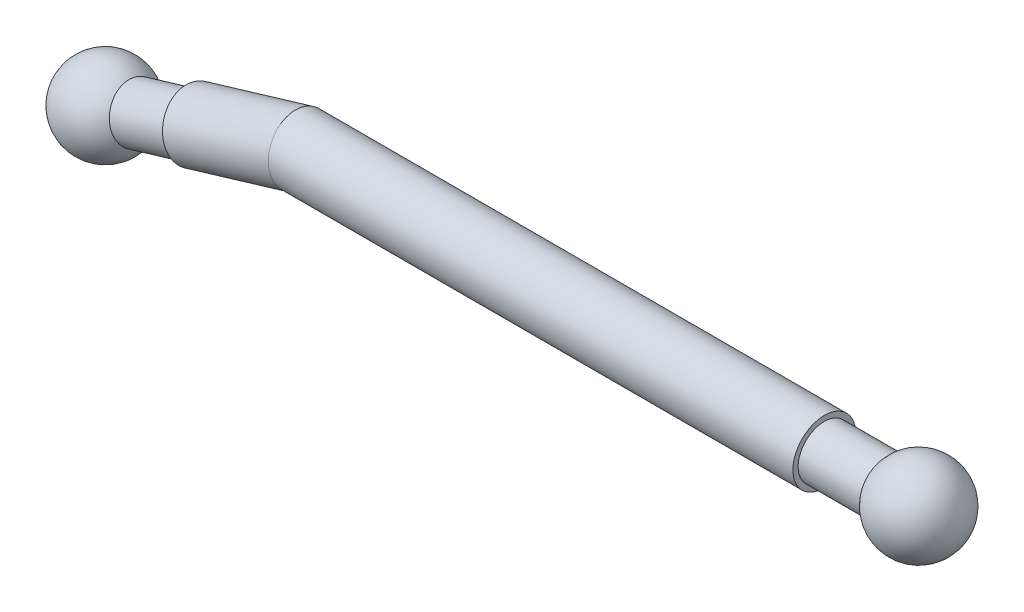
ISO-10303-21;
HEADER;
FILE_DESCRIPTION(('STEP AP214'),'2;1');
FILE_NAME('part.step','',(''),(''),'','','');
FILE_SCHEMA(('AUTOMOTIVE_DESIGN { 1 0 10303 214 1 1 1 1 }'));
ENDSEC;
DATA;
#1=APPLICATION_CONTEXT('core data for automotive mechanical design processes');
#2=APPLICATION_PROTOCOL_DEFINITION('international standard','automotive_design',2000,#1);
#3=PRODUCT_CONTEXT('',#1,'mechanical');
#4=PRODUCT('Part','Part','',(#3));
#5=PRODUCT_RELATED_PRODUCT_CATEGORY('part','',(#4));
#6=PRODUCT_DEFINITION_FORMATION('','',#4);
#7=PRODUCT_DEFINITION_CONTEXT('part definition',#1,'design');
#8=PRODUCT_DEFINITION('design','',#6,#7);
#9=PRODUCT_DEFINITION_SHAPE('','',#8);
#10=(LENGTH_UNIT() NAMED_UNIT(*) SI_UNIT(.MILLI.,.METRE.));
#11=(NAMED_UNIT(*) PLANE_ANGLE_UNIT() SI_UNIT($,.RADIAN.));
#12=(NAMED_UNIT(*) SI_UNIT($,.STERADIAN.) SOLID_ANGLE_UNIT());
#13=UNCERTAINTY_MEASURE_WITH_UNIT(LENGTH_MEASURE(1.E-05),#10,'distance_accuracy_value','');
#14=(GEOMETRIC_REPRESENTATION_CONTEXT(3) GLOBAL_UNCERTAINTY_ASSIGNED_CONTEXT((#13)) GLOBAL_UNIT_ASSIGNED_CONTEXT((#10,
#11,#12)) REPRESENTATION_CONTEXT('',''));
#15=CARTESIAN_POINT('',(0.,0.,0.));
#16=DIRECTION('',(0.,0.,1.));
#17=DIRECTION('',(1.,0.,0.));
#18=AXIS2_PLACEMENT_3D('',#15,#16,#17);
#19=CARTESIAN_POINT('',(6.,0.,0.));
#20=DIRECTION('',(-1.,0.,0.));
#21=DIRECTION('',(0.,0.,1.));
#22=AXIS2_PLACEMENT_3D('',#19,#20,#21);
#23=CYLINDRICAL_SURFACE('',#22,2.5);
#24=CARTESIAN_POINT('',(0.,0.,0.));
#25=DIRECTION('',(1.,0.,0.));
#26=DIRECTION('',(0.,0.,-1.));
#27=AXIS2_PLACEMENT_3D('',#24,#25,#26);
#28=CIRCLE('',#27,2.5);
#29=CARTESIAN_POINT('',(0.,0.,-2.5));
#30=VERTEX_POINT('',#29);
#31=EDGE_CURVE('E52',#30,#30,#28,.T.);
#32=ORIENTED_EDGE('',*,*,#31,.T.);
#33=EDGE_LOOP('',(#32));
#34=FACE_BOUND('',#33,.T.);
#35=CARTESIAN_POINT('',(5.8775010008008,0.,0.));
#36=DIRECTION('',(1.,0.,0.));
#37=DIRECTION('',(0.,0.,-1.));
#38=AXIS2_PLACEMENT_3D('',#35,#36,#37);
#39=CIRCLE('',#38,2.5);
#40=CARTESIAN_POINT('',(5.8775010008008,0.,-2.5));
#41=VERTEX_POINT('',#40);
#42=EDGE_CURVE('E13',#41,#41,#39,.T.);
#43=ORIENTED_EDGE('',*,*,#42,.F.);
#44=EDGE_LOOP('',(#43));
#45=FACE_BOUND('',#44,.T.);
#46=ADVANCED_FACE('F44',(#34,#45),#23,.T.);
#47=CARTESIAN_POINT('',(-65.7083900276338,-4.85264625904171,0.));
#48=DIRECTION('',(0.957826285221151,0.287347885566345,0.));
#49=DIRECTION('',(-0.287347885566345,0.957826285221152,0.));
#50=AXIS2_PLACEMENT_3D('',#47,#48,#49);
#51=CYLINDRICAL_SURFACE('',#50,2.5);
#52=CARTESIAN_POINT('',(-59.9614323163069,-3.12855894564364,0.));
#53=DIRECTION('',(-0.957826285221152,-0.287347885566345,0.));
#54=DIRECTION('',(0.287347885566345,-0.957826285221152,0.));
#55=AXIS2_PLACEMENT_3D('',#52,#53,#54);
#56=CIRCLE('',#55,2.5);
#57=CARTESIAN_POINT('',(-59.2430626023911,-5.52312465869652,0.));
#58=VERTEX_POINT('',#57);
#59=EDGE_CURVE('E70',#58,#58,#56,.T.);
#60=ORIENTED_EDGE('',*,*,#59,.T.);
#61=EDGE_LOOP('',(#60));
#62=FACE_BOUND('',#61,.T.);
#63=CARTESIAN_POINT('',(-65.5910572662876,-4.81744643063784,0.));
#64=DIRECTION('',(-0.957826285221151,-0.287347885566345,0.));
#65=DIRECTION('',(0.287347885566345,-0.957826285221152,0.));
#66=AXIS2_PLACEMENT_3D('',#63,#64,#65);
#67=CIRCLE('',#66,2.5);
#68=CARTESIAN_POINT('',(-64.8726875523717,-7.21201214369072,0.));
#69=VERTEX_POINT('',#68);
#70=EDGE_CURVE('E73',#69,#69,#67,.T.);
#71=ORIENTED_EDGE('',*,*,#70,.F.);
#72=EDGE_LOOP('',(#71));
#73=FACE_BOUND('',#72,.T.);
#74=ADVANCED_FACE('F95',(#62,#73),#51,.T.);
#75=CARTESIAN_POINT('',(-60.,-3.,0.));
#76=DIRECTION('',(0.957826285221151,0.287347885566345,0.));
#77=DIRECTION('',(0.,0.,-1.));
#78=AXIS2_PLACEMENT_3D('',#75,#76,#77);
#79=PLANE('',#78);
#80=ORIENTED_EDGE('',*,*,#59,.F.);
#81=EDGE_LOOP('',(#80));
#82=FACE_BOUND('',#81,.T.);
#83=CARTESIAN_POINT('',(-60.,-3.,0.));
#84=DIRECTION('',(0.957826285221151,0.287347885566345,0.));
#85=DIRECTION('',(0.,0.,-1.));
#86=AXIS2_PLACEMENT_3D('',#83,#84,#85);
#87=CIRCLE('',#86,3.);
#88=CARTESIAN_POINT('',(-60.,-3.,-3.));
#89=VERTEX_POINT('',#88);
#90=EDGE_CURVE('E57',#89,#89,#87,.T.);
#91=ORIENTED_EDGE('',*,*,#90,.F.);
#92=EDGE_LOOP('',(#91));
#93=FACE_BOUND('',#92,.T.);
#94=ADVANCED_FACE('F46',(#82,#93),#79,.F.);
#95=CARTESIAN_POINT('',(0.,0.,0.));
#96=DIRECTION('',(1.,0.,0.));
#97=DIRECTION('',(0.,0.,-1.));
#98=AXIS2_PLACEMENT_3D('',#95,#96,#97);
#99=PLANE('',#98);
#100=ORIENTED_EDGE('',*,*,#31,.F.);
#101=EDGE_LOOP('',(#100));
#102=FACE_BOUND('',#101,.T.);
#103=CARTESIAN_POINT('',(0.,0.,0.));
#104=DIRECTION('',(1.,0.,0.));
#105=DIRECTION('',(0.,0.,-1.));
#106=AXIS2_PLACEMENT_3D('',#103,#104,#105);
#107=CIRCLE('',#106,3.);
#108=CARTESIAN_POINT('',(0.,0.,-3.));
#109=VERTEX_POINT('',#108);
#110=EDGE_CURVE('E62',#109,#109,#107,.T.);
#111=ORIENTED_EDGE('',*,*,#110,.T.);
#112=EDGE_LOOP('',(#111));
#113=FACE_BOUND('',#112,.T.);
#114=ADVANCED_FACE('F86',(#102,#113),#99,.T.);
#115=CARTESIAN_POINT('',(-48.9763956463432,0.307081306097034,0.));
#116=DIRECTION('',(-0.957826285221151,-0.287347885566345,0.));
#117=DIRECTION('',(0.287347885566345,-0.957826285221151,0.));
#118=AXIS2_PLACEMENT_3D('',#115,#116,#117);
#119=CYLINDRICAL_SURFACE('',#118,3.);
#120=CARTESIAN_POINT('',(-50.,0.,0.));
#121=DIRECTION('',(-0.989400395497483,-0.145213144685405,0.));
#122=DIRECTION('',(-0.145213144685405,0.989400395497483,0.));
#123=AXIS2_PLACEMENT_3D('',#120,#121,#122);
#124=ELLIPSE('',#123,3.0321394792768,3.);
#125=CARTESIAN_POINT('',(-50.4403065089106,3.,0.));
#126=VERTEX_POINT('',#125);
#127=EDGE_CURVE('E67',#126,#126,#124,.T.);
#128=ORIENTED_EDGE('',*,*,#127,.T.);
#129=EDGE_LOOP('',(#128));
#130=FACE_BOUND('',#129,.T.);
#131=ORIENTED_EDGE('',*,*,#90,.T.);
#132=EDGE_LOOP('',(#131));
#133=FACE_BOUND('',#132,.T.);
#134=ADVANCED_FACE('F89',(#130,#133),#119,.T.);
#135=CARTESIAN_POINT('',(0.,0.,0.));
#136=DIRECTION('',(-1.,0.,0.));
#137=DIRECTION('',(0.,-1.,0.));
#138=AXIS2_PLACEMENT_3D('',#135,#136,#137);
#139=CYLINDRICAL_SURFACE('',#138,3.);
#140=ORIENTED_EDGE('',*,*,#110,.F.);
#141=EDGE_LOOP('',(#140));
#142=FACE_BOUND('',#141,.T.);
#143=ORIENTED_EDGE('',*,*,#127,.F.);
#144=EDGE_LOOP('',(#143));
#145=FACE_BOUND('',#144,.T.);
#146=ADVANCED_FACE('F68',(#142,#145),#139,.T.);
#147=CARTESIAN_POINT('',(-68.5818688832973,-5.71468991574075,0.));
#148=DIRECTION('',(-0.287347885566346,0.957826285221151,0.));
#149=DIRECTION('',(0.,0.,-1.));
#150=AXIS2_PLACEMENT_3D('',#147,#148,#149);
#151=SPHERICAL_SURFACE('',#150,4.);
#152=CARTESIAN_POINT('',(-68.5818688832973,-5.71468991574075,0.));
#153=DIRECTION('',(-0.957826285221152,-0.287347885566345,0.));
#154=DIRECTION('',(0.287347885566345,-0.957826285221151,0.));
#155=AXIS2_PLACEMENT_3D('',#152,#153,#154);
#156=SPHERICAL_SURFACE('',#155,4.);
#157=ORIENTED_EDGE('',*,*,#70,.T.);
#158=EDGE_LOOP('',(#157));
#159=FACE_BOUND('',#158,.T.);
#160=ADVANCED_FACE('F97',(#159),#156,.T.);
#161=CARTESIAN_POINT('',(9.,0.,0.));
#162=DIRECTION('',(0.,1.,0.));
#163=DIRECTION('',(0.,0.,1.));
#164=AXIS2_PLACEMENT_3D('',#161,#162,#163);
#165=SPHERICAL_SURFACE('',#164,4.);
#166=CARTESIAN_POINT('',(9.,0.,0.));
#167=DIRECTION('',(1.,0.,0.));
#168=DIRECTION('',(0.,0.,-1.));
#169=AXIS2_PLACEMENT_3D('',#166,#167,#168);
#170=SPHERICAL_SURFACE('',#169,4.);
#171=ORIENTED_EDGE('',*,*,#42,.T.);
#172=EDGE_LOOP('',(#171));
#173=FACE_BOUND('',#172,.T.);
#174=ADVANCED_FACE('F107',(#173),#170,.T.);
#175=CLOSED_SHELL('',(#46,#74,#94,#114,#134,#146,#160,#174));
#176=MANIFOLD_SOLID_BREP('B2',#175);
#177=ADVANCED_BREP_SHAPE_REPRESENTATION('',(#18,#176),#14);
#178=SHAPE_DEFINITION_REPRESENTATION(#9,#177);
ENDSEC;
END-ISO-10303-21;
